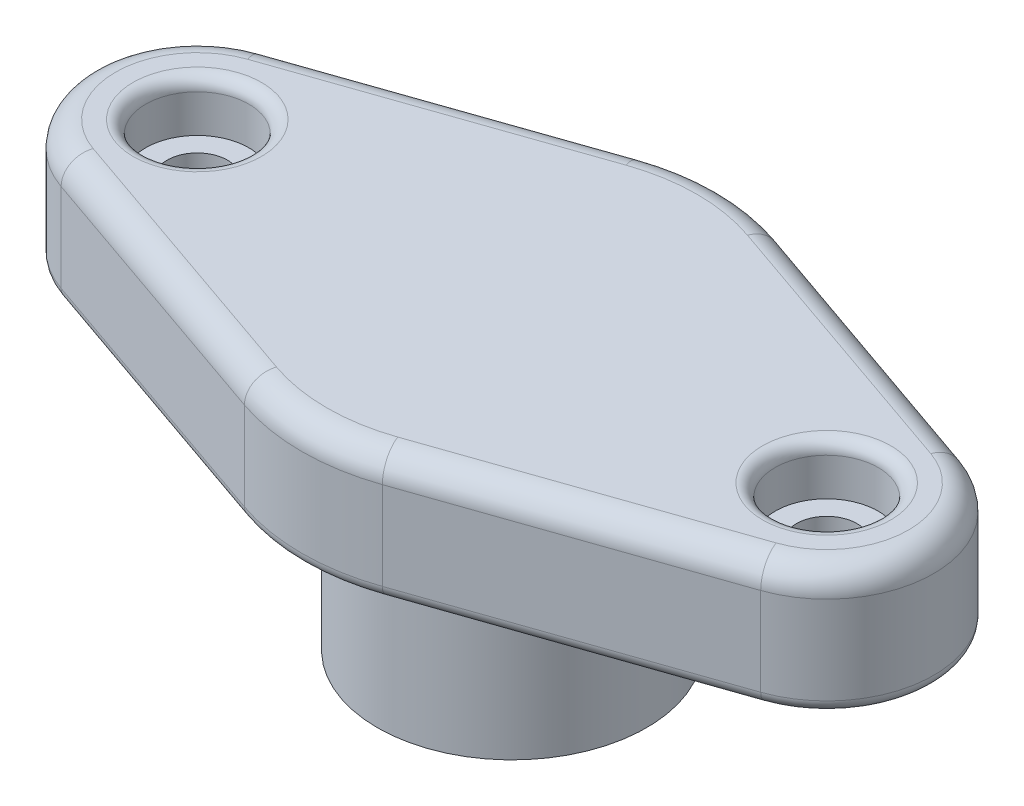
ISO-10303-21;
HEADER;
FILE_DESCRIPTION(('STEP AP214'),'2;1');
FILE_NAME('part.step','',(''),(''),'','','');
FILE_SCHEMA(('AUTOMOTIVE_DESIGN { 1 0 10303 214 1 1 1 1 }'));
ENDSEC;
DATA;
#1=APPLICATION_CONTEXT('core data for automotive mechanical design processes');
#2=APPLICATION_PROTOCOL_DEFINITION('international standard','automotive_design',2000,#1);
#3=PRODUCT_CONTEXT('',#1,'mechanical');
#4=PRODUCT('Part','Part','',(#3));
#5=PRODUCT_RELATED_PRODUCT_CATEGORY('part','',(#4));
#6=PRODUCT_DEFINITION_FORMATION('','',#4);
#7=PRODUCT_DEFINITION_CONTEXT('part definition',#1,'design');
#8=PRODUCT_DEFINITION('design','',#6,#7);
#9=PRODUCT_DEFINITION_SHAPE('','',#8);
#10=(LENGTH_UNIT() NAMED_UNIT(*) SI_UNIT(.MILLI.,.METRE.));
#11=(NAMED_UNIT(*) PLANE_ANGLE_UNIT() SI_UNIT($,.RADIAN.));
#12=(NAMED_UNIT(*) SI_UNIT($,.STERADIAN.) SOLID_ANGLE_UNIT());
#13=UNCERTAINTY_MEASURE_WITH_UNIT(LENGTH_MEASURE(1.E-05),#10,'distance_accuracy_value','');
#14=(GEOMETRIC_REPRESENTATION_CONTEXT(3) GLOBAL_UNCERTAINTY_ASSIGNED_CONTEXT((#13)) GLOBAL_UNIT_ASSIGNED_CONTEXT((#10,
#11,#12)) REPRESENTATION_CONTEXT('',''));
#15=CARTESIAN_POINT('',(0.,0.,0.));
#16=DIRECTION('',(0.,0.,1.));
#17=DIRECTION('',(1.,0.,0.));
#18=AXIS2_PLACEMENT_3D('',#15,#16,#17);
#19=CARTESIAN_POINT('',(12.5,12.,0.));
#20=DIRECTION('',(0.,-1.,0.));
#21=DIRECTION('',(0.,0.,-1.));
#22=AXIS2_PLACEMENT_3D('',#19,#20,#21);
#23=CYLINDRICAL_SURFACE('',#22,1.2);
#24=CARTESIAN_POINT('',(12.5,7.,0.));
#25=DIRECTION('',(0.,1.,0.));
#26=DIRECTION('',(0.,0.,1.));
#27=AXIS2_PLACEMENT_3D('',#24,#25,#26);
#28=CIRCLE('',#27,1.2);
#29=CARTESIAN_POINT('',(12.5,7.,1.2));
#30=VERTEX_POINT('',#29);
#31=EDGE_CURVE('E401',#30,#30,#28,.T.);
#32=ORIENTED_EDGE('',*,*,#31,.F.);
#33=EDGE_LOOP('',(#32));
#34=FACE_BOUND('',#33,.T.);
#35=CARTESIAN_POINT('',(12.5,10.,0.));
#36=DIRECTION('',(0.,1.,0.));
#37=DIRECTION('',(0.,0.,1.));
#38=AXIS2_PLACEMENT_3D('',#35,#36,#37);
#39=CIRCLE('',#38,1.2);
#40=CARTESIAN_POINT('',(12.5,10.,1.2));
#41=VERTEX_POINT('',#40);
#42=EDGE_CURVE('E210',#41,#41,#39,.T.);
#43=ORIENTED_EDGE('',*,*,#42,.T.);
#44=EDGE_LOOP('',(#43));
#45=FACE_BOUND('',#44,.T.);
#46=ADVANCED_FACE('F45',(#34,#45),#23,.F.);
#47=CARTESIAN_POINT('',(-12.5,12.,0.));
#48=DIRECTION('',(0.,-1.,0.));
#49=DIRECTION('',(0.,0.,-1.));
#50=AXIS2_PLACEMENT_3D('',#47,#48,#49);
#51=CYLINDRICAL_SURFACE('',#50,1.2);
#52=CARTESIAN_POINT('',(-12.5,7.,0.));
#53=DIRECTION('',(0.,1.,0.));
#54=DIRECTION('',(0.,0.,1.));
#55=AXIS2_PLACEMENT_3D('',#52,#53,#54);
#56=CIRCLE('',#55,1.2);
#57=CARTESIAN_POINT('',(-12.5,7.,1.2));
#58=VERTEX_POINT('',#57);
#59=EDGE_CURVE('E398',#58,#58,#56,.T.);
#60=ORIENTED_EDGE('',*,*,#59,.F.);
#61=EDGE_LOOP('',(#60));
#62=FACE_BOUND('',#61,.T.);
#63=CARTESIAN_POINT('',(-12.5,10.,0.));
#64=DIRECTION('',(0.,1.,0.));
#65=DIRECTION('',(0.,0.,1.));
#66=AXIS2_PLACEMENT_3D('',#63,#64,#65);
#67=CIRCLE('',#66,1.2);
#68=CARTESIAN_POINT('',(-12.5,10.,1.2));
#69=VERTEX_POINT('',#68);
#70=EDGE_CURVE('E392',#69,#69,#67,.T.);
#71=ORIENTED_EDGE('',*,*,#70,.T.);
#72=EDGE_LOOP('',(#71));
#73=FACE_BOUND('',#72,.T.);
#74=ADVANCED_FACE('F442',(#62,#73),#51,.F.);
#75=CARTESIAN_POINT('',(0.,7.,0.));
#76=DIRECTION('',(0.,-1.,0.));
#77=DIRECTION('',(0.,0.,-1.));
#78=AXIS2_PLACEMENT_3D('',#75,#76,#77);
#79=CYLINDRICAL_SURFACE('',#78,5.35);
#80=CARTESIAN_POINT('',(0.,7.,0.));
#81=DIRECTION('',(0.,1.,0.));
#82=DIRECTION('',(0.,0.,1.));
#83=AXIS2_PLACEMENT_3D('',#80,#81,#82);
#84=CIRCLE('',#83,5.35);
#85=CARTESIAN_POINT('',(0.,7.,5.35));
#86=VERTEX_POINT('',#85);
#87=EDGE_CURVE('E200',#86,#86,#84,.T.);
#88=ORIENTED_EDGE('',*,*,#87,.F.);
#89=EDGE_LOOP('',(#88));
#90=FACE_BOUND('',#89,.T.);
#91=CARTESIAN_POINT('',(0.,0.,0.));
#92=DIRECTION('',(0.,1.,0.));
#93=DIRECTION('',(0.,0.,1.));
#94=AXIS2_PLACEMENT_3D('',#91,#92,#93);
#95=CIRCLE('',#94,5.35);
#96=CARTESIAN_POINT('',(0.,0.,5.35));
#97=VERTEX_POINT('',#96);
#98=EDGE_CURVE('E207',#97,#97,#95,.T.);
#99=ORIENTED_EDGE('',*,*,#98,.T.);
#100=EDGE_LOOP('',(#99));
#101=FACE_BOUND('',#100,.T.);
#102=ADVANCED_FACE('F429',(#90,#101),#79,.T.);
#103=CARTESIAN_POINT('',(0.,0.,0.));
#104=DIRECTION('',(0.,1.,0.));
#105=DIRECTION('',(0.,0.,1.));
#106=AXIS2_PLACEMENT_3D('',#103,#104,#105);
#107=PLANE('',#106);
#108=CARTESIAN_POINT('',(0.,0.,0.));
#109=DIRECTION('',(0.,1.,0.));
#110=DIRECTION('',(0.,0.,1.));
#111=AXIS2_PLACEMENT_3D('',#108,#109,#110);
#112=CIRCLE('',#111,4.5);
#113=CARTESIAN_POINT('',(0.,0.,4.5));
#114=VERTEX_POINT('',#113);
#115=EDGE_CURVE('E55',#114,#114,#112,.T.);
#116=ORIENTED_EDGE('',*,*,#115,.T.);
#117=EDGE_LOOP('',(#116));
#118=FACE_BOUND('',#117,.T.);
#119=ORIENTED_EDGE('',*,*,#98,.F.);
#120=EDGE_LOOP('',(#119));
#121=FACE_BOUND('',#120,.T.);
#122=ADVANCED_FACE('F375',(#118,#121),#107,.F.);
#123=CARTESIAN_POINT('',(0.,12.,0.));
#124=DIRECTION('',(0.,1.,0.));
#125=DIRECTION('',(0.,0.,1.));
#126=AXIS2_PLACEMENT_3D('',#123,#124,#125);
#127=PLANE('',#126);
#128=CARTESIAN_POINT('',(0.,12.,0.));
#129=DIRECTION('',(0.,1.,0.));
#130=DIRECTION('',(0.,0.,1.));
#131=AXIS2_PLACEMENT_3D('',#128,#129,#130);
#132=CIRCLE('',#131,7.35);
#133=CARTESIAN_POINT('',(2.41079999999999,12.,-6.94338126275664));
#134=VERTEX_POINT('',#133);
#135=CARTESIAN_POINT('',(-2.4108,12.,-6.94338126275664));
#136=VERTEX_POINT('',#135);
#137=EDGE_CURVE('E312',#134,#136,#132,.T.);
#138=ORIENTED_EDGE('',*,*,#137,.T.);
#139=DIRECTION('',(-0.944677722824033,0.,0.328));
#140=VECTOR('',#139,1.);
#141=CARTESIAN_POINT('',(-13.566,12.,-3.0702025991781));
#142=LINE('',#141,#140);
#143=CARTESIAN_POINT('',(-13.566,12.,-3.07020259917811));
#144=VERTEX_POINT('',#143);
#145=EDGE_CURVE('E315',#136,#144,#142,.T.);
#146=ORIENTED_EDGE('',*,*,#145,.T.);
#147=CARTESIAN_POINT('',(-12.5,12.,0.));
#148=DIRECTION('',(0.,1.,0.));
#149=DIRECTION('',(0.,0.,1.));
#150=AXIS2_PLACEMENT_3D('',#147,#148,#149);
#151=CIRCLE('',#150,3.25);
#152=CARTESIAN_POINT('',(-13.566,12.,3.0702025991781));
#153=VERTEX_POINT('',#152);
#154=EDGE_CURVE('E268',#144,#153,#151,.T.);
#155=ORIENTED_EDGE('',*,*,#154,.T.);
#156=DIRECTION('',(0.944677722824033,0.,0.328));
#157=VECTOR('',#156,1.);
#158=CARTESIAN_POINT('',(-2.4108,12.,6.94338126275664));
#159=LINE('',#158,#157);
#160=CARTESIAN_POINT('',(-2.4108,12.,6.94338126275664));
#161=VERTEX_POINT('',#160);
#162=EDGE_CURVE('E297',#153,#161,#159,.T.);
#163=ORIENTED_EDGE('',*,*,#162,.T.);
#164=CARTESIAN_POINT('',(0.,12.,0.));
#165=DIRECTION('',(0.,1.,0.));
#166=DIRECTION('',(0.,0.,1.));
#167=AXIS2_PLACEMENT_3D('',#164,#165,#166);
#168=CIRCLE('',#167,7.35);
#169=CARTESIAN_POINT('',(2.4108,12.,6.94338126275664));
#170=VERTEX_POINT('',#169);
#171=EDGE_CURVE('E300',#161,#170,#168,.T.);
#172=ORIENTED_EDGE('',*,*,#171,.T.);
#173=DIRECTION('',(0.944677722824033,0.,-0.328));
#174=VECTOR('',#173,1.);
#175=CARTESIAN_POINT('',(13.566,12.,3.0702025991781));
#176=LINE('',#175,#174);
#177=CARTESIAN_POINT('',(13.566,12.,3.0702025991781));
#178=VERTEX_POINT('',#177);
#179=EDGE_CURVE('E303',#170,#178,#176,.T.);
#180=ORIENTED_EDGE('',*,*,#179,.T.);
#181=CARTESIAN_POINT('',(12.5,12.,0.));
#182=DIRECTION('',(0.,1.,0.));
#183=DIRECTION('',(0.,0.,1.));
#184=AXIS2_PLACEMENT_3D('',#181,#182,#183);
#185=CIRCLE('',#184,3.25);
#186=CARTESIAN_POINT('',(13.566,12.,-3.07020259917811));
#187=VERTEX_POINT('',#186);
#188=EDGE_CURVE('E306',#178,#187,#185,.T.);
#189=ORIENTED_EDGE('',*,*,#188,.T.);
#190=DIRECTION('',(-0.944677722824033,0.,-0.327999999999999));
#191=VECTOR('',#190,1.);
#192=CARTESIAN_POINT('',(2.41079999999999,12.,-6.94338126275664));
#193=LINE('',#192,#191);
#194=EDGE_CURVE('E309',#187,#134,#193,.T.);
#195=ORIENTED_EDGE('',*,*,#194,.T.);
#196=EDGE_LOOP('',(#138,#146,#155,#163,#172,#180,#189,#195));
#197=FACE_BOUND('',#196,.T.);
#198=CARTESIAN_POINT('',(12.5,12.,0.));
#199=DIRECTION('',(0.,1.,0.));
#200=DIRECTION('',(0.,0.,1.));
#201=AXIS2_PLACEMENT_3D('',#198,#199,#200);
#202=CIRCLE('',#201,2.55);
#203=CARTESIAN_POINT('',(12.5,12.,2.55));
#204=VERTEX_POINT('',#203);
#205=EDGE_CURVE('E261',#204,#204,#202,.F.);
#206=ORIENTED_EDGE('',*,*,#205,.T.);
#207=EDGE_LOOP('',(#206));
#208=FACE_BOUND('',#207,.T.);
#209=CARTESIAN_POINT('',(-12.5,12.,0.));
#210=DIRECTION('',(0.,1.,0.));
#211=DIRECTION('',(0.,0.,1.));
#212=AXIS2_PLACEMENT_3D('',#209,#210,#211);
#213=CIRCLE('',#212,2.55);
#214=CARTESIAN_POINT('',(-12.5,12.,2.55));
#215=VERTEX_POINT('',#214);
#216=EDGE_CURVE('E257',#215,#215,#213,.F.);
#217=ORIENTED_EDGE('',*,*,#216,.T.);
#218=EDGE_LOOP('',(#217));
#219=FACE_BOUND('',#218,.T.);
#220=ADVANCED_FACE('F431',(#197,#208,#219),#127,.T.);
#221=CARTESIAN_POINT('',(0.,7.,0.));
#222=DIRECTION('',(0.,1.,0.));
#223=DIRECTION('',(0.,0.,1.));
#224=AXIS2_PLACEMENT_3D('',#221,#222,#223);
#225=PLANE('',#224);
#226=DIRECTION('',(0.944677722824033,0.,0.328));
#227=VECTOR('',#226,1.);
#228=CARTESIAN_POINT('',(-2.5748,7.,7.41572012416865));
#229=LINE('',#228,#227);
#230=CARTESIAN_POINT('',(-2.5748,7.,7.41572012416865));
#231=VERTEX_POINT('',#230);
#232=CARTESIAN_POINT('',(-13.73,7.,3.54254146059012));
#233=VERTEX_POINT('',#232);
#234=EDGE_CURVE('E199',#231,#233,#229,.F.);
#235=ORIENTED_EDGE('',*,*,#234,.T.);
#236=CARTESIAN_POINT('',(-12.5,7.,0.));
#237=DIRECTION('',(0.,1.,0.));
#238=DIRECTION('',(0.,0.,1.));
#239=AXIS2_PLACEMENT_3D('',#236,#237,#238);
#240=CIRCLE('',#239,3.75);
#241=CARTESIAN_POINT('',(-13.73,7.,-3.54254146059012));
#242=VERTEX_POINT('',#241);
#243=EDGE_CURVE('E180',#233,#242,#240,.F.);
#244=ORIENTED_EDGE('',*,*,#243,.T.);
#245=DIRECTION('',(-0.944677722824033,0.,0.328));
#246=VECTOR('',#245,1.);
#247=CARTESIAN_POINT('',(-2.5748,7.,-7.41572012416865));
#248=LINE('',#247,#246);
#249=CARTESIAN_POINT('',(-2.5748,7.,-7.41572012416865));
#250=VERTEX_POINT('',#249);
#251=EDGE_CURVE('E227',#242,#250,#248,.F.);
#252=ORIENTED_EDGE('',*,*,#251,.T.);
#253=CARTESIAN_POINT('',(0.,7.,0.));
#254=DIRECTION('',(0.,1.,0.));
#255=DIRECTION('',(0.,0.,1.));
#256=AXIS2_PLACEMENT_3D('',#253,#254,#255);
#257=CIRCLE('',#256,7.85);
#258=CARTESIAN_POINT('',(2.57479999999999,7.,-7.41572012416865));
#259=VERTEX_POINT('',#258);
#260=EDGE_CURVE('E224',#250,#259,#257,.F.);
#261=ORIENTED_EDGE('',*,*,#260,.T.);
#262=DIRECTION('',(-0.944677722824033,0.,-0.327999999999999));
#263=VECTOR('',#262,1.);
#264=CARTESIAN_POINT('',(2.57479999999999,7.,-7.41572012416865));
#265=LINE('',#264,#263);
#266=CARTESIAN_POINT('',(13.73,7.,-3.54254146059013));
#267=VERTEX_POINT('',#266);
#268=EDGE_CURVE('E221',#259,#267,#265,.F.);
#269=ORIENTED_EDGE('',*,*,#268,.T.);
#270=CARTESIAN_POINT('',(12.5,7.,0.));
#271=DIRECTION('',(0.,1.,0.));
#272=DIRECTION('',(0.,0.,1.));
#273=AXIS2_PLACEMENT_3D('',#270,#271,#272);
#274=CIRCLE('',#273,3.75);
#275=CARTESIAN_POINT('',(13.73,7.,3.54254146059012));
#276=VERTEX_POINT('',#275);
#277=EDGE_CURVE('E218',#267,#276,#274,.F.);
#278=ORIENTED_EDGE('',*,*,#277,.T.);
#279=DIRECTION('',(0.944677722824033,0.,-0.328));
#280=VECTOR('',#279,1.);
#281=CARTESIAN_POINT('',(2.5748,7.,7.41572012416865));
#282=LINE('',#281,#280);
#283=CARTESIAN_POINT('',(2.5748,7.,7.41572012416865));
#284=VERTEX_POINT('',#283);
#285=EDGE_CURVE('E215',#276,#284,#282,.F.);
#286=ORIENTED_EDGE('',*,*,#285,.T.);
#287=CARTESIAN_POINT('',(0.,7.,0.));
#288=DIRECTION('',(0.,1.,0.));
#289=DIRECTION('',(0.,0.,1.));
#290=AXIS2_PLACEMENT_3D('',#287,#288,#289);
#291=CIRCLE('',#290,7.85);
#292=EDGE_CURVE('E204',#284,#231,#291,.F.);
#293=ORIENTED_EDGE('',*,*,#292,.T.);
#294=EDGE_LOOP('',(#235,#244,#252,#261,#269,#278,#286,#293));
#295=FACE_BOUND('',#294,.T.);
#296=ORIENTED_EDGE('',*,*,#87,.T.);
#297=EDGE_LOOP('',(#296));
#298=FACE_BOUND('',#297,.T.);
#299=ORIENTED_EDGE('',*,*,#31,.T.);
#300=EDGE_LOOP('',(#299));
#301=FACE_BOUND('',#300,.T.);
#302=ORIENTED_EDGE('',*,*,#59,.T.);
#303=EDGE_LOOP('',(#302));
#304=FACE_BOUND('',#303,.T.);
#305=ADVANCED_FACE('F438',(#295,#298,#301,#304),#225,.F.);
#306=CARTESIAN_POINT('',(0.,12.,0.));
#307=DIRECTION('',(0.,-1.,0.));
#308=DIRECTION('',(0.,0.,-1.));
#309=AXIS2_PLACEMENT_3D('',#306,#307,#308);
#310=CYLINDRICAL_SURFACE('',#309,8.35);
#311=DIRECTION('',(0.,-1.,0.));
#312=VECTOR('',#311,1.);
#313=CARTESIAN_POINT('',(-2.7388,12.,-7.88805898558067));
#314=LINE('',#313,#312);
#315=CARTESIAN_POINT('',(-2.7388,11.,-7.88805898558067));
#316=VERTEX_POINT('',#315);
#317=CARTESIAN_POINT('',(-2.7388,7.5,-7.88805898558067));
#318=VERTEX_POINT('',#317);
#319=EDGE_CURVE('E421',#316,#318,#314,.T.);
#320=ORIENTED_EDGE('',*,*,#319,.F.);
#321=CARTESIAN_POINT('',(0.,11.,0.));
#322=DIRECTION('',(0.,1.,0.));
#323=DIRECTION('',(0.,0.,1.));
#324=AXIS2_PLACEMENT_3D('',#321,#322,#323);
#325=CIRCLE('',#324,8.35);
#326=CARTESIAN_POINT('',(2.73879999999999,11.,-7.88805898558067));
#327=VERTEX_POINT('',#326);
#328=EDGE_CURVE('E323',#316,#327,#325,.F.);
#329=ORIENTED_EDGE('',*,*,#328,.T.);
#330=DIRECTION('',(0.,-1.,0.));
#331=VECTOR('',#330,1.);
#332=CARTESIAN_POINT('',(2.73879999999999,12.,-7.88805898558067));
#333=LINE('',#332,#331);
#334=CARTESIAN_POINT('',(2.73879999999999,7.5,-7.88805898558067));
#335=VERTEX_POINT('',#334);
#336=EDGE_CURVE('E405',#327,#335,#333,.T.);
#337=ORIENTED_EDGE('',*,*,#336,.T.);
#338=CARTESIAN_POINT('',(0.,7.5,0.));
#339=DIRECTION('',(0.,1.,0.));
#340=DIRECTION('',(0.,0.,1.));
#341=AXIS2_PLACEMENT_3D('',#338,#339,#340);
#342=CIRCLE('',#341,8.35);
#343=EDGE_CURVE('E235',#335,#318,#342,.T.);
#344=ORIENTED_EDGE('',*,*,#343,.T.);
#345=EDGE_LOOP('',(#320,#329,#337,#344));
#346=FACE_BOUND('',#345,.T.);
#347=ADVANCED_FACE('F460',(#346),#310,.T.);
#348=CARTESIAN_POINT('',(-13.894,12.,-4.01488032200213));
#349=DIRECTION('',(0.328,0.,0.944677722824033));
#350=DIRECTION('',(0.944677722824033,0.,-0.328));
#351=AXIS2_PLACEMENT_3D('',#348,#349,#350);
#352=PLANE('',#351);
#353=DIRECTION('',(0.,-1.,0.));
#354=VECTOR('',#353,1.);
#355=CARTESIAN_POINT('',(-13.894,12.,-4.01488032200214));
#356=LINE('',#355,#354);
#357=CARTESIAN_POINT('',(-13.894,11.,-4.01488032200214));
#358=VERTEX_POINT('',#357);
#359=CARTESIAN_POINT('',(-13.894,7.5,-4.01488032200214));
#360=VERTEX_POINT('',#359);
#361=EDGE_CURVE('E169',#358,#360,#356,.T.);
#362=ORIENTED_EDGE('',*,*,#361,.F.);
#363=DIRECTION('',(-0.944677722824033,0.,0.328));
#364=VECTOR('',#363,1.);
#365=CARTESIAN_POINT('',(-2.7388,11.,-7.88805898558067));
#366=LINE('',#365,#364);
#367=EDGE_CURVE('E319',#358,#316,#366,.F.);
#368=ORIENTED_EDGE('',*,*,#367,.T.);
#369=ORIENTED_EDGE('',*,*,#319,.T.);
#370=DIRECTION('',(-0.944677722824033,0.,0.328));
#371=VECTOR('',#370,1.);
#372=CARTESIAN_POINT('',(-13.894,7.5,-4.01488032200213));
#373=LINE('',#372,#371);
#374=EDGE_CURVE('E232',#318,#360,#373,.T.);
#375=ORIENTED_EDGE('',*,*,#374,.T.);
#376=EDGE_LOOP('',(#362,#368,#369,#375));
#377=FACE_BOUND('',#376,.T.);
#378=ADVANCED_FACE('F482',(#377),#352,.F.);
#379=CARTESIAN_POINT('',(-12.5,12.,0.));
#380=DIRECTION('',(0.,-1.,0.));
#381=DIRECTION('',(0.,0.,-1.));
#382=AXIS2_PLACEMENT_3D('',#379,#380,#381);
#383=CYLINDRICAL_SURFACE('',#382,4.25);
#384=DIRECTION('',(0.,-1.,0.));
#385=VECTOR('',#384,1.);
#386=CARTESIAN_POINT('',(-13.894,12.,4.01488032200214));
#387=LINE('',#386,#385);
#388=CARTESIAN_POINT('',(-13.894,11.,4.01488032200214));
#389=VERTEX_POINT('',#388);
#390=CARTESIAN_POINT('',(-13.894,7.5,4.01488032200214));
#391=VERTEX_POINT('',#390);
#392=EDGE_CURVE('E159',#389,#391,#387,.T.);
#393=ORIENTED_EDGE('',*,*,#392,.F.);
#394=CARTESIAN_POINT('',(-12.5,11.,0.));
#395=DIRECTION('',(0.,1.,0.));
#396=DIRECTION('',(0.,0.,1.));
#397=AXIS2_PLACEMENT_3D('',#394,#395,#396);
#398=CIRCLE('',#397,4.25);
#399=EDGE_CURVE('E339',#389,#358,#398,.F.);
#400=ORIENTED_EDGE('',*,*,#399,.T.);
#401=ORIENTED_EDGE('',*,*,#361,.T.);
#402=CARTESIAN_POINT('',(-12.5,7.5,0.));
#403=DIRECTION('',(0.,1.,0.));
#404=DIRECTION('',(0.,0.,1.));
#405=AXIS2_PLACEMENT_3D('',#402,#403,#404);
#406=CIRCLE('',#405,4.25);
#407=EDGE_CURVE('E178',#360,#391,#406,.T.);
#408=ORIENTED_EDGE('',*,*,#407,.T.);
#409=EDGE_LOOP('',(#393,#400,#401,#408));
#410=FACE_BOUND('',#409,.T.);
#411=ADVANCED_FACE('F195',(#410),#383,.T.);
#412=CARTESIAN_POINT('',(-2.7388,12.,7.88805898558067));
#413=DIRECTION('',(0.328,0.,-0.944677722824033));
#414=DIRECTION('',(-0.944677722824033,0.,-0.328));
#415=AXIS2_PLACEMENT_3D('',#412,#413,#414);
#416=PLANE('',#415);
#417=DIRECTION('',(0.,-1.,0.));
#418=VECTOR('',#417,1.);
#419=CARTESIAN_POINT('',(-2.7388,12.,7.88805898558067));
#420=LINE('',#419,#418);
#421=CARTESIAN_POINT('',(-2.7388,11.,7.88805898558067));
#422=VERTEX_POINT('',#421);
#423=CARTESIAN_POINT('',(-2.7388,7.5,7.88805898558067));
#424=VERTEX_POINT('',#423);
#425=EDGE_CURVE('E170',#422,#424,#420,.T.);
#426=ORIENTED_EDGE('',*,*,#425,.F.);
#427=DIRECTION('',(0.944677722824033,0.,0.328));
#428=VECTOR('',#427,1.);
#429=CARTESIAN_POINT('',(-13.894,11.,4.01488032200214));
#430=LINE('',#429,#428);
#431=EDGE_CURVE('E62',#422,#389,#430,.F.);
#432=ORIENTED_EDGE('',*,*,#431,.T.);
#433=ORIENTED_EDGE('',*,*,#392,.T.);
#434=DIRECTION('',(0.944677722824033,0.,0.328));
#435=VECTOR('',#434,1.);
#436=CARTESIAN_POINT('',(-2.7388,7.5,7.88805898558067));
#437=LINE('',#436,#435);
#438=EDGE_CURVE('E163',#391,#424,#437,.T.);
#439=ORIENTED_EDGE('',*,*,#438,.T.);
#440=EDGE_LOOP('',(#426,#432,#433,#439));
#441=FACE_BOUND('',#440,.T.);
#442=ADVANCED_FACE('F161',(#441),#416,.F.);
#443=CARTESIAN_POINT('',(0.,12.,0.));
#444=DIRECTION('',(0.,-1.,0.));
#445=DIRECTION('',(0.,0.,-1.));
#446=AXIS2_PLACEMENT_3D('',#443,#444,#445);
#447=CYLINDRICAL_SURFACE('',#446,8.35);
#448=DIRECTION('',(0.,-1.,0.));
#449=VECTOR('',#448,1.);
#450=CARTESIAN_POINT('',(2.7388,12.,7.88805898558067));
#451=LINE('',#450,#449);
#452=CARTESIAN_POINT('',(2.7388,11.,7.88805898558067));
#453=VERTEX_POINT('',#452);
#454=CARTESIAN_POINT('',(2.7388,7.5,7.88805898558067));
#455=VERTEX_POINT('',#454);
#456=EDGE_CURVE('E414',#453,#455,#451,.T.);
#457=ORIENTED_EDGE('',*,*,#456,.F.);
#458=CARTESIAN_POINT('',(0.,11.,0.));
#459=DIRECTION('',(0.,1.,0.));
#460=DIRECTION('',(0.,0.,1.));
#461=AXIS2_PLACEMENT_3D('',#458,#459,#460);
#462=CIRCLE('',#461,8.35);
#463=EDGE_CURVE('E70',#453,#422,#462,.F.);
#464=ORIENTED_EDGE('',*,*,#463,.T.);
#465=ORIENTED_EDGE('',*,*,#425,.T.);
#466=CARTESIAN_POINT('',(0.,7.5,0.));
#467=DIRECTION('',(0.,1.,0.));
#468=DIRECTION('',(0.,0.,1.));
#469=AXIS2_PLACEMENT_3D('',#466,#467,#468);
#470=CIRCLE('',#469,8.35);
#471=EDGE_CURVE('E193',#424,#455,#470,.T.);
#472=ORIENTED_EDGE('',*,*,#471,.T.);
#473=EDGE_LOOP('',(#457,#464,#465,#472));
#474=FACE_BOUND('',#473,.T.);
#475=ADVANCED_FACE('F474',(#474),#447,.T.);
#476=CARTESIAN_POINT('',(13.894,12.,4.01488032200213));
#477=DIRECTION('',(-0.328,0.,-0.944677722824033));
#478=DIRECTION('',(-0.944677722824033,0.,0.328));
#479=AXIS2_PLACEMENT_3D('',#476,#477,#478);
#480=PLANE('',#479);
#481=DIRECTION('',(0.,-1.,0.));
#482=VECTOR('',#481,1.);
#483=CARTESIAN_POINT('',(13.894,12.,4.01488032200213));
#484=LINE('',#483,#482);
#485=CARTESIAN_POINT('',(13.894,11.,4.01488032200213));
#486=VERTEX_POINT('',#485);
#487=CARTESIAN_POINT('',(13.894,7.5,4.01488032200213));
#488=VERTEX_POINT('',#487);
#489=EDGE_CURVE('E411',#486,#488,#484,.T.);
#490=ORIENTED_EDGE('',*,*,#489,.F.);
#491=DIRECTION('',(0.944677722824033,0.,-0.328));
#492=VECTOR('',#491,1.);
#493=CARTESIAN_POINT('',(2.7388,11.,7.88805898558067));
#494=LINE('',#493,#492);
#495=EDGE_CURVE('E332',#486,#453,#494,.F.);
#496=ORIENTED_EDGE('',*,*,#495,.T.);
#497=ORIENTED_EDGE('',*,*,#456,.T.);
#498=DIRECTION('',(0.944677722824033,0.,-0.328));
#499=VECTOR('',#498,1.);
#500=CARTESIAN_POINT('',(13.894,7.5,4.01488032200213));
#501=LINE('',#500,#499);
#502=EDGE_CURVE('E247',#455,#488,#501,.T.);
#503=ORIENTED_EDGE('',*,*,#502,.T.);
#504=EDGE_LOOP('',(#490,#496,#497,#503));
#505=FACE_BOUND('',#504,.T.);
#506=ADVANCED_FACE('F470',(#505),#480,.F.);
#507=CARTESIAN_POINT('',(12.5,12.,0.));
#508=DIRECTION('',(0.,-1.,0.));
#509=DIRECTION('',(0.,0.,-1.));
#510=AXIS2_PLACEMENT_3D('',#507,#508,#509);
#511=CYLINDRICAL_SURFACE('',#510,4.25);
#512=DIRECTION('',(0.,-1.,0.));
#513=VECTOR('',#512,1.);
#514=CARTESIAN_POINT('',(13.894,12.,-4.01488032200214));
#515=LINE('',#514,#513);
#516=CARTESIAN_POINT('',(13.894,11.,-4.01488032200214));
#517=VERTEX_POINT('',#516);
#518=CARTESIAN_POINT('',(13.894,7.5,-4.01488032200214));
#519=VERTEX_POINT('',#518);
#520=EDGE_CURVE('E408',#517,#519,#515,.T.);
#521=ORIENTED_EDGE('',*,*,#520,.F.);
#522=CARTESIAN_POINT('',(12.5,11.,0.));
#523=DIRECTION('',(0.,1.,0.));
#524=DIRECTION('',(0.,0.,1.));
#525=AXIS2_PLACEMENT_3D('',#522,#523,#524);
#526=CIRCLE('',#525,4.25);
#527=EDGE_CURVE('E329',#517,#486,#526,.F.);
#528=ORIENTED_EDGE('',*,*,#527,.T.);
#529=ORIENTED_EDGE('',*,*,#489,.T.);
#530=CARTESIAN_POINT('',(12.5,7.5,0.));
#531=DIRECTION('',(0.,1.,0.));
#532=DIRECTION('',(0.,0.,1.));
#533=AXIS2_PLACEMENT_3D('',#530,#531,#532);
#534=CIRCLE('',#533,4.25);
#535=EDGE_CURVE('E243',#488,#519,#534,.T.);
#536=ORIENTED_EDGE('',*,*,#535,.T.);
#537=EDGE_LOOP('',(#521,#528,#529,#536));
#538=FACE_BOUND('',#537,.T.);
#539=ADVANCED_FACE('F466',(#538),#511,.T.);
#540=CARTESIAN_POINT('',(2.73879999999999,12.,-7.88805898558067));
#541=DIRECTION('',(-0.327999999999999,0.,0.944677722824033));
#542=DIRECTION('',(0.944677722824033,0.,0.327999999999999));
#543=AXIS2_PLACEMENT_3D('',#540,#541,#542);
#544=PLANE('',#543);
#545=ORIENTED_EDGE('',*,*,#336,.F.);
#546=DIRECTION('',(-0.944677722824033,0.,-0.327999999999999));
#547=VECTOR('',#546,1.);
#548=CARTESIAN_POINT('',(13.894,11.,-4.01488032200214));
#549=LINE('',#548,#547);
#550=EDGE_CURVE('E326',#327,#517,#549,.F.);
#551=ORIENTED_EDGE('',*,*,#550,.T.);
#552=ORIENTED_EDGE('',*,*,#520,.T.);
#553=DIRECTION('',(-0.944677722824033,0.,-0.327999999999999));
#554=VECTOR('',#553,1.);
#555=CARTESIAN_POINT('',(2.73879999999999,7.5,-7.88805898558067));
#556=LINE('',#555,#554);
#557=EDGE_CURVE('E239',#519,#335,#556,.T.);
#558=ORIENTED_EDGE('',*,*,#557,.T.);
#559=EDGE_LOOP('',(#545,#551,#552,#558));
#560=FACE_BOUND('',#559,.T.);
#561=ADVANCED_FACE('F462',(#560),#544,.F.);
#562=CARTESIAN_POINT('',(-12.5,10.,0.));
#563=DIRECTION('',(0.,1.,0.));
#564=DIRECTION('',(0.,0.,1.));
#565=AXIS2_PLACEMENT_3D('',#562,#563,#564);
#566=CYLINDRICAL_SURFACE('',#565,2.05);
#567=CARTESIAN_POINT('',(-12.5,11.5,0.));
#568=DIRECTION('',(0.,1.,0.));
#569=DIRECTION('',(0.,0.,1.));
#570=AXIS2_PLACEMENT_3D('',#567,#568,#569);
#571=CIRCLE('',#570,2.05);
#572=CARTESIAN_POINT('',(-12.5,11.5,2.05));
#573=VERTEX_POINT('',#572);
#574=EDGE_CURVE('E265',#573,#573,#571,.T.);
#575=ORIENTED_EDGE('',*,*,#574,.T.);
#576=EDGE_LOOP('',(#575));
#577=FACE_BOUND('',#576,.T.);
#578=CARTESIAN_POINT('',(-12.5,10.,0.));
#579=DIRECTION('',(0.,1.,0.));
#580=DIRECTION('',(0.,0.,1.));
#581=AXIS2_PLACEMENT_3D('',#578,#579,#580);
#582=CIRCLE('',#581,2.05);
#583=CARTESIAN_POINT('',(-12.5,10.,2.05));
#584=VERTEX_POINT('',#583);
#585=EDGE_CURVE('E388',#584,#584,#582,.T.);
#586=ORIENTED_EDGE('',*,*,#585,.F.);
#587=EDGE_LOOP('',(#586));
#588=FACE_BOUND('',#587,.T.);
#589=ADVANCED_FACE('F465',(#577,#588),#566,.F.);
#590=CARTESIAN_POINT('',(-12.5,10.,0.));
#591=DIRECTION('',(0.,1.,0.));
#592=DIRECTION('',(0.,0.,1.));
#593=AXIS2_PLACEMENT_3D('',#590,#591,#592);
#594=PLANE('',#593);
#595=ORIENTED_EDGE('',*,*,#70,.F.);
#596=EDGE_LOOP('',(#595));
#597=FACE_BOUND('',#596,.T.);
#598=ORIENTED_EDGE('',*,*,#585,.T.);
#599=EDGE_LOOP('',(#598));
#600=FACE_BOUND('',#599,.T.);
#601=ADVANCED_FACE('F669',(#597,#600),#594,.T.);
#602=CARTESIAN_POINT('',(12.5,10.,0.));
#603=DIRECTION('',(0.,1.,0.));
#604=DIRECTION('',(0.,0.,1.));
#605=AXIS2_PLACEMENT_3D('',#602,#603,#604);
#606=CYLINDRICAL_SURFACE('',#605,2.05);
#607=CARTESIAN_POINT('',(12.5,11.5,0.));
#608=DIRECTION('',(0.,1.,0.));
#609=DIRECTION('',(0.,0.,1.));
#610=AXIS2_PLACEMENT_3D('',#607,#608,#609);
#611=CIRCLE('',#610,2.05);
#612=CARTESIAN_POINT('',(12.5,11.5,2.05));
#613=VERTEX_POINT('',#612);
#614=EDGE_CURVE('E192',#613,#613,#611,.T.);
#615=ORIENTED_EDGE('',*,*,#614,.T.);
#616=EDGE_LOOP('',(#615));
#617=FACE_BOUND('',#616,.T.);
#618=CARTESIAN_POINT('',(12.5,10.,0.));
#619=DIRECTION('',(0.,1.,0.));
#620=DIRECTION('',(0.,0.,1.));
#621=AXIS2_PLACEMENT_3D('',#618,#619,#620);
#622=CIRCLE('',#621,2.05);
#623=CARTESIAN_POINT('',(12.5,10.,2.05));
#624=VERTEX_POINT('',#623);
#625=EDGE_CURVE('E294',#624,#624,#622,.T.);
#626=ORIENTED_EDGE('',*,*,#625,.F.);
#627=EDGE_LOOP('',(#626));
#628=FACE_BOUND('',#627,.T.);
#629=ADVANCED_FACE('F672',(#617,#628),#606,.F.);
#630=CARTESIAN_POINT('',(12.5,10.,0.));
#631=DIRECTION('',(0.,1.,0.));
#632=DIRECTION('',(0.,0.,1.));
#633=AXIS2_PLACEMENT_3D('',#630,#631,#632);
#634=PLANE('',#633);
#635=ORIENTED_EDGE('',*,*,#42,.F.);
#636=EDGE_LOOP('',(#635));
#637=FACE_BOUND('',#636,.T.);
#638=ORIENTED_EDGE('',*,*,#625,.T.);
#639=EDGE_LOOP('',(#638));
#640=FACE_BOUND('',#639,.T.);
#641=ADVANCED_FACE('F573',(#637,#640),#634,.T.);
#642=CARTESIAN_POINT('',(12.5,7.5,0.));
#643=DIRECTION('',(0.,1.,0.));
#644=DIRECTION('',(0.,0.,1.));
#645=AXIS2_PLACEMENT_3D('',#642,#643,#644);
#646=TOROIDAL_SURFACE('',#645,3.75,0.5);
#647=CARTESIAN_POINT('',(13.73,7.5,3.54254146059012));
#648=DIRECTION('',(-0.944677722824032,0.,0.328000000000002));
#649=DIRECTION('',(0.328000000000002,0.,0.944677722824032));
#650=AXIS2_PLACEMENT_3D('',#647,#648,#649);
#651=CIRCLE('',#650,0.5);
#652=EDGE_CURVE('E286',#276,#488,#651,.T.);
#653=ORIENTED_EDGE('',*,*,#652,.F.);
#654=ORIENTED_EDGE('',*,*,#277,.F.);
#655=CARTESIAN_POINT('',(13.73,7.5,-3.54254146059013));
#656=DIRECTION('',(-0.944677722824033,0.,-0.327999999999999));
#657=DIRECTION('',(-0.327999999999999,0.,0.944677722824033));
#658=AXIS2_PLACEMENT_3D('',#655,#656,#657);
#659=CIRCLE('',#658,0.5);
#660=EDGE_CURVE('E290',#519,#267,#659,.T.);
#661=ORIENTED_EDGE('',*,*,#660,.F.);
#662=ORIENTED_EDGE('',*,*,#535,.F.);
#663=EDGE_LOOP('',(#653,#654,#661,#662));
#664=FACE_BOUND('',#663,.T.);
#665=ADVANCED_FACE('F544',(#664),#646,.T.);
#666=CARTESIAN_POINT('',(2.57479999999999,7.5,-7.41572012416865));
#667=DIRECTION('',(-0.944677722824033,0.,-0.327999999999999));
#668=DIRECTION('',(-0.327999999999999,0.,0.944677722824033));
#669=AXIS2_PLACEMENT_3D('',#666,#667,#668);
#670=CYLINDRICAL_SURFACE('',#669,0.5);
#671=ORIENTED_EDGE('',*,*,#660,.T.);
#672=ORIENTED_EDGE('',*,*,#268,.F.);
#673=CARTESIAN_POINT('',(2.57479999999999,7.5,-7.41572012416865));
#674=DIRECTION('',(-0.944677722824033,0.,-0.327999999999999));
#675=DIRECTION('',(-0.327999999999999,0.,0.944677722824033));
#676=AXIS2_PLACEMENT_3D('',#673,#674,#675);
#677=CIRCLE('',#676,0.5);
#678=EDGE_CURVE('E282',#335,#259,#677,.T.);
#679=ORIENTED_EDGE('',*,*,#678,.F.);
#680=ORIENTED_EDGE('',*,*,#557,.F.);
#681=EDGE_LOOP('',(#671,#672,#679,#680));
#682=FACE_BOUND('',#681,.T.);
#683=ADVANCED_FACE('F548',(#682),#670,.T.);
#684=CARTESIAN_POINT('',(13.73,7.5,3.54254146059012));
#685=DIRECTION('',(0.944677722824033,0.,-0.328));
#686=DIRECTION('',(-0.328,0.,-0.944677722824033));
#687=AXIS2_PLACEMENT_3D('',#684,#685,#686);
#688=CYLINDRICAL_SURFACE('',#687,0.5);
#689=ORIENTED_EDGE('',*,*,#652,.T.);
#690=ORIENTED_EDGE('',*,*,#502,.F.);
#691=CARTESIAN_POINT('',(2.5748,7.5,7.41572012416865));
#692=DIRECTION('',(-0.944677722824033,0.,0.328));
#693=DIRECTION('',(0.328,0.,0.944677722824033));
#694=AXIS2_PLACEMENT_3D('',#691,#692,#693);
#695=CIRCLE('',#694,0.5);
#696=EDGE_CURVE('E278',#284,#455,#695,.T.);
#697=ORIENTED_EDGE('',*,*,#696,.F.);
#698=ORIENTED_EDGE('',*,*,#285,.F.);
#699=EDGE_LOOP('',(#689,#690,#697,#698));
#700=FACE_BOUND('',#699,.T.);
#701=ADVANCED_FACE('F535',(#700),#688,.T.);
#702=CARTESIAN_POINT('',(0.,7.5,0.));
#703=DIRECTION('',(0.,1.,0.));
#704=DIRECTION('',(0.,0.,1.));
#705=AXIS2_PLACEMENT_3D('',#702,#703,#704);
#706=TOROIDAL_SURFACE('',#705,7.85,0.5);
#707=ORIENTED_EDGE('',*,*,#678,.T.);
#708=ORIENTED_EDGE('',*,*,#260,.F.);
#709=CARTESIAN_POINT('',(-2.5748,7.5,-7.41572012416865));
#710=DIRECTION('',(-0.944677722824033,0.,0.328));
#711=DIRECTION('',(0.328,0.,0.944677722824033));
#712=AXIS2_PLACEMENT_3D('',#709,#710,#711);
#713=CIRCLE('',#712,0.5);
#714=EDGE_CURVE('E274',#318,#250,#713,.T.);
#715=ORIENTED_EDGE('',*,*,#714,.F.);
#716=ORIENTED_EDGE('',*,*,#343,.F.);
#717=EDGE_LOOP('',(#707,#708,#715,#716));
#718=FACE_BOUND('',#717,.T.);
#719=ADVANCED_FACE('F551',(#718),#706,.T.);
#720=CARTESIAN_POINT('',(0.,7.5,0.));
#721=DIRECTION('',(0.,1.,0.));
#722=DIRECTION('',(0.,0.,1.));
#723=AXIS2_PLACEMENT_3D('',#720,#721,#722);
#724=TOROIDAL_SURFACE('',#723,7.85,0.5);
#725=ORIENTED_EDGE('',*,*,#696,.T.);
#726=ORIENTED_EDGE('',*,*,#471,.F.);
#727=CARTESIAN_POINT('',(-2.5748,7.5,7.41572012416865));
#728=DIRECTION('',(-0.944677722824033,0.,-0.328));
#729=DIRECTION('',(-0.328,0.,0.944677722824033));
#730=AXIS2_PLACEMENT_3D('',#727,#728,#729);
#731=CIRCLE('',#730,0.5);
#732=EDGE_CURVE('E190',#231,#424,#731,.T.);
#733=ORIENTED_EDGE('',*,*,#732,.F.);
#734=ORIENTED_EDGE('',*,*,#292,.F.);
#735=EDGE_LOOP('',(#725,#726,#733,#734));
#736=FACE_BOUND('',#735,.T.);
#737=ADVANCED_FACE('F539',(#736),#724,.T.);
#738=CARTESIAN_POINT('',(-13.73,7.5,-3.54254146059012));
#739=DIRECTION('',(-0.944677722824033,0.,0.328));
#740=DIRECTION('',(0.328,0.,0.944677722824033));
#741=AXIS2_PLACEMENT_3D('',#738,#739,#740);
#742=CYLINDRICAL_SURFACE('',#741,0.5);
#743=ORIENTED_EDGE('',*,*,#714,.T.);
#744=ORIENTED_EDGE('',*,*,#251,.F.);
#745=CARTESIAN_POINT('',(-13.73,7.5,-3.54254146059012));
#746=DIRECTION('',(-0.944677722824033,0.,0.327999999999999));
#747=DIRECTION('',(0.327999999999999,0.,0.944677722824033));
#748=AXIS2_PLACEMENT_3D('',#745,#746,#747);
#749=CIRCLE('',#748,0.5);
#750=EDGE_CURVE('E184',#360,#242,#749,.T.);
#751=ORIENTED_EDGE('',*,*,#750,.F.);
#752=ORIENTED_EDGE('',*,*,#374,.F.);
#753=EDGE_LOOP('',(#743,#744,#751,#752));
#754=FACE_BOUND('',#753,.T.);
#755=ADVANCED_FACE('F554',(#754),#742,.T.);
#756=CARTESIAN_POINT('',(-2.5748,7.5,7.41572012416865));
#757=DIRECTION('',(0.944677722824033,0.,0.328));
#758=DIRECTION('',(0.328,0.,-0.944677722824033));
#759=AXIS2_PLACEMENT_3D('',#756,#757,#758);
#760=CYLINDRICAL_SURFACE('',#759,0.5);
#761=ORIENTED_EDGE('',*,*,#732,.T.);
#762=ORIENTED_EDGE('',*,*,#438,.F.);
#763=CARTESIAN_POINT('',(-13.73,7.5,3.54254146059012));
#764=DIRECTION('',(-0.944677722824033,0.,-0.327999999999998));
#765=DIRECTION('',(-0.327999999999998,0.,0.944677722824033));
#766=AXIS2_PLACEMENT_3D('',#763,#764,#765);
#767=CIRCLE('',#766,0.5);
#768=EDGE_CURVE('E176',#233,#391,#767,.T.);
#769=ORIENTED_EDGE('',*,*,#768,.F.);
#770=ORIENTED_EDGE('',*,*,#234,.F.);
#771=EDGE_LOOP('',(#761,#762,#769,#770));
#772=FACE_BOUND('',#771,.T.);
#773=ADVANCED_FACE('F188',(#772),#760,.T.);
#774=CARTESIAN_POINT('',(-12.5,7.5,0.));
#775=DIRECTION('',(0.,1.,0.));
#776=DIRECTION('',(0.,0.,1.));
#777=AXIS2_PLACEMENT_3D('',#774,#775,#776);
#778=TOROIDAL_SURFACE('',#777,3.75,0.5);
#779=ORIENTED_EDGE('',*,*,#750,.T.);
#780=ORIENTED_EDGE('',*,*,#243,.F.);
#781=ORIENTED_EDGE('',*,*,#768,.T.);
#782=ORIENTED_EDGE('',*,*,#407,.F.);
#783=EDGE_LOOP('',(#779,#780,#781,#782));
#784=FACE_BOUND('',#783,.T.);
#785=ADVANCED_FACE('F177',(#784),#778,.T.);
#786=CARTESIAN_POINT('',(12.5,11.5,0.));
#787=DIRECTION('',(0.,1.,0.));
#788=DIRECTION('',(0.,0.,1.));
#789=AXIS2_PLACEMENT_3D('',#786,#787,#788);
#790=TOROIDAL_SURFACE('',#789,2.55,0.5);
#791=ORIENTED_EDGE('',*,*,#205,.F.);
#792=EDGE_LOOP('',(#791));
#793=FACE_BOUND('',#792,.T.);
#794=ORIENTED_EDGE('',*,*,#614,.F.);
#795=EDGE_LOOP('',(#794));
#796=FACE_BOUND('',#795,.T.);
#797=ADVANCED_FACE('F574',(#793,#796),#790,.T.);
#798=CARTESIAN_POINT('',(-12.5,11.5,0.));
#799=DIRECTION('',(0.,1.,0.));
#800=DIRECTION('',(0.,0.,1.));
#801=AXIS2_PLACEMENT_3D('',#798,#799,#800);
#802=TOROIDAL_SURFACE('',#801,2.55,0.5);
#803=ORIENTED_EDGE('',*,*,#216,.F.);
#804=EDGE_LOOP('',(#803));
#805=FACE_BOUND('',#804,.T.);
#806=ORIENTED_EDGE('',*,*,#574,.F.);
#807=EDGE_LOOP('',(#806));
#808=FACE_BOUND('',#807,.T.);
#809=ADVANCED_FACE('F577',(#805,#808),#802,.T.);
#810=CARTESIAN_POINT('',(2.4108,11.,6.94338126275664));
#811=DIRECTION('',(-0.944677722824033,0.,0.328));
#812=DIRECTION('',(0.328,0.,0.944677722824033));
#813=AXIS2_PLACEMENT_3D('',#810,#811,#812);
#814=CYLINDRICAL_SURFACE('',#813,1.);
#815=CARTESIAN_POINT('',(2.4108,11.,6.94338126275664));
#816=DIRECTION('',(-0.944677722824033,0.,0.328));
#817=DIRECTION('',(0.328,0.,0.944677722824033));
#818=AXIS2_PLACEMENT_3D('',#815,#816,#817);
#819=CIRCLE('',#818,1.);
#820=EDGE_CURVE('E364',#453,#170,#819,.T.);
#821=ORIENTED_EDGE('',*,*,#820,.F.);
#822=ORIENTED_EDGE('',*,*,#495,.F.);
#823=CARTESIAN_POINT('',(13.566,11.,3.0702025991781));
#824=DIRECTION('',(0.944677722824033,0.,-0.328));
#825=DIRECTION('',(-0.328,0.,-0.944677722824033));
#826=AXIS2_PLACEMENT_3D('',#823,#824,#825);
#827=CIRCLE('',#826,1.);
#828=EDGE_CURVE('E185',#178,#486,#827,.T.);
#829=ORIENTED_EDGE('',*,*,#828,.F.);
#830=ORIENTED_EDGE('',*,*,#179,.F.);
#831=EDGE_LOOP('',(#821,#822,#829,#830));
#832=FACE_BOUND('',#831,.T.);
#833=ADVANCED_FACE('F530',(#832),#814,.T.);
#834=CARTESIAN_POINT('',(12.5,11.,0.));
#835=DIRECTION('',(0.,1.,0.));
#836=DIRECTION('',(0.,0.,1.));
#837=AXIS2_PLACEMENT_3D('',#834,#835,#836);
#838=TOROIDAL_SURFACE('',#837,3.25,1.);
#839=ORIENTED_EDGE('',*,*,#828,.T.);
#840=ORIENTED_EDGE('',*,*,#527,.F.);
#841=CARTESIAN_POINT('',(13.566,11.,-3.07020259917811));
#842=DIRECTION('',(-0.944677722824033,0.,-0.328));
#843=DIRECTION('',(-0.328000000000001,0.,0.944677722824033));
#844=AXIS2_PLACEMENT_3D('',#841,#842,#843);
#845=CIRCLE('',#844,1.);
#846=EDGE_CURVE('E360',#187,#517,#845,.T.);
#847=ORIENTED_EDGE('',*,*,#846,.F.);
#848=ORIENTED_EDGE('',*,*,#188,.F.);
#849=EDGE_LOOP('',(#839,#840,#847,#848));
#850=FACE_BOUND('',#849,.T.);
#851=ADVANCED_FACE('F523',(#850),#838,.T.);
#852=CARTESIAN_POINT('',(0.,11.,0.));
#853=DIRECTION('',(0.,1.,0.));
#854=DIRECTION('',(0.,0.,1.));
#855=AXIS2_PLACEMENT_3D('',#852,#853,#854);
#856=TOROIDAL_SURFACE('',#855,7.35,1.);
#857=ORIENTED_EDGE('',*,*,#820,.T.);
#858=ORIENTED_EDGE('',*,*,#171,.F.);
#859=CARTESIAN_POINT('',(-2.4108,11.,6.94338126275664));
#860=DIRECTION('',(-0.944677722824033,0.,-0.328));
#861=DIRECTION('',(-0.328,0.,0.944677722824033));
#862=AXIS2_PLACEMENT_3D('',#859,#860,#861);
#863=CIRCLE('',#862,1.);
#864=EDGE_CURVE('E356',#422,#161,#863,.T.);
#865=ORIENTED_EDGE('',*,*,#864,.F.);
#866=ORIENTED_EDGE('',*,*,#463,.F.);
#867=EDGE_LOOP('',(#857,#858,#865,#866));
#868=FACE_BOUND('',#867,.T.);
#869=ADVANCED_FACE('F594',(#868),#856,.T.);
#870=CARTESIAN_POINT('',(2.41079999999999,11.,-6.94338126275664));
#871=DIRECTION('',(0.944677722824033,0.,0.327999999999999));
#872=DIRECTION('',(0.327999999999999,0.,-0.944677722824033));
#873=AXIS2_PLACEMENT_3D('',#870,#871,#872);
#874=CYLINDRICAL_SURFACE('',#873,1.);
#875=ORIENTED_EDGE('',*,*,#846,.T.);
#876=ORIENTED_EDGE('',*,*,#550,.F.);
#877=CARTESIAN_POINT('',(2.41079999999999,11.,-6.94338126275664));
#878=DIRECTION('',(-0.944677722824033,0.,-0.327999999999999));
#879=DIRECTION('',(-0.327999999999999,0.,0.944677722824033));
#880=AXIS2_PLACEMENT_3D('',#877,#878,#879);
#881=CIRCLE('',#880,1.);
#882=EDGE_CURVE('E352',#134,#327,#881,.T.);
#883=ORIENTED_EDGE('',*,*,#882,.F.);
#884=ORIENTED_EDGE('',*,*,#194,.F.);
#885=EDGE_LOOP('',(#875,#876,#883,#884));
#886=FACE_BOUND('',#885,.T.);
#887=ADVANCED_FACE('F515',(#886),#874,.T.);
#888=CARTESIAN_POINT('',(-2.4108,11.,6.94338126275664));
#889=DIRECTION('',(-0.944677722824033,0.,-0.328));
#890=DIRECTION('',(-0.328,0.,0.944677722824033));
#891=AXIS2_PLACEMENT_3D('',#888,#889,#890);
#892=CYLINDRICAL_SURFACE('',#891,1.);
#893=ORIENTED_EDGE('',*,*,#864,.T.);
#894=ORIENTED_EDGE('',*,*,#162,.F.);
#895=CARTESIAN_POINT('',(-13.566,11.,3.07020259917811));
#896=DIRECTION('',(-0.944677722824033,0.,-0.328));
#897=DIRECTION('',(-0.328,0.,0.944677722824033));
#898=AXIS2_PLACEMENT_3D('',#895,#896,#897);
#899=CIRCLE('',#898,1.);
#900=EDGE_CURVE('E348',#389,#153,#899,.T.);
#901=ORIENTED_EDGE('',*,*,#900,.F.);
#902=ORIENTED_EDGE('',*,*,#431,.F.);
#903=EDGE_LOOP('',(#893,#894,#901,#902));
#904=FACE_BOUND('',#903,.T.);
#905=ADVANCED_FACE('F588',(#904),#892,.T.);
#906=CARTESIAN_POINT('',(0.,11.,0.));
#907=DIRECTION('',(0.,1.,0.));
#908=DIRECTION('',(0.,0.,1.));
#909=AXIS2_PLACEMENT_3D('',#906,#907,#908);
#910=TOROIDAL_SURFACE('',#909,7.35,1.);
#911=ORIENTED_EDGE('',*,*,#882,.T.);
#912=ORIENTED_EDGE('',*,*,#328,.F.);
#913=CARTESIAN_POINT('',(-2.4108,11.,-6.94338126275664));
#914=DIRECTION('',(-0.944677722824033,0.,0.328));
#915=DIRECTION('',(0.328,0.,0.944677722824033));
#916=AXIS2_PLACEMENT_3D('',#913,#914,#915);
#917=CIRCLE('',#916,1.);
#918=EDGE_CURVE('E345',#136,#316,#917,.T.);
#919=ORIENTED_EDGE('',*,*,#918,.F.);
#920=ORIENTED_EDGE('',*,*,#137,.F.);
#921=EDGE_LOOP('',(#911,#912,#919,#920));
#922=FACE_BOUND('',#921,.T.);
#923=ADVANCED_FACE('F512',(#922),#910,.T.);
#924=CARTESIAN_POINT('',(-12.5,11.,0.));
#925=DIRECTION('',(0.,1.,0.));
#926=DIRECTION('',(0.,0.,1.));
#927=AXIS2_PLACEMENT_3D('',#924,#925,#926);
#928=TOROIDAL_SURFACE('',#927,3.25,1.);
#929=ORIENTED_EDGE('',*,*,#900,.T.);
#930=ORIENTED_EDGE('',*,*,#154,.F.);
#931=CARTESIAN_POINT('',(-13.566,11.,-3.0702025991781));
#932=DIRECTION('',(0.944677722824033,0.,-0.328));
#933=DIRECTION('',(-0.328,0.,-0.944677722824033));
#934=AXIS2_PLACEMENT_3D('',#931,#932,#933);
#935=CIRCLE('',#934,1.);
#936=EDGE_CURVE('E342',#358,#144,#935,.T.);
#937=ORIENTED_EDGE('',*,*,#936,.F.);
#938=ORIENTED_EDGE('',*,*,#399,.F.);
#939=EDGE_LOOP('',(#929,#930,#937,#938));
#940=FACE_BOUND('',#939,.T.);
#941=ADVANCED_FACE('F505',(#940),#928,.T.);
#942=CARTESIAN_POINT('',(-2.4108,11.,-6.94338126275664));
#943=DIRECTION('',(0.944677722824033,0.,-0.328));
#944=DIRECTION('',(-0.328,0.,-0.944677722824033));
#945=AXIS2_PLACEMENT_3D('',#942,#943,#944);
#946=CYLINDRICAL_SURFACE('',#945,1.);
#947=ORIENTED_EDGE('',*,*,#918,.T.);
#948=ORIENTED_EDGE('',*,*,#367,.F.);
#949=ORIENTED_EDGE('',*,*,#936,.T.);
#950=ORIENTED_EDGE('',*,*,#145,.F.);
#951=EDGE_LOOP('',(#947,#948,#949,#950));
#952=FACE_BOUND('',#951,.T.);
#953=ADVANCED_FACE('F499',(#952),#946,.T.);
#954=CARTESIAN_POINT('',(0.,2.,0.));
#955=DIRECTION('',(0.,-1.,0.));
#956=DIRECTION('',(0.,0.,-1.));
#957=AXIS2_PLACEMENT_3D('',#954,#955,#956);
#958=PLANE('',#957);
#959=CARTESIAN_POINT('',(0.,2.,0.));
#960=DIRECTION('',(0.,-1.,0.));
#961=DIRECTION('',(0.,0.,-1.));
#962=AXIS2_PLACEMENT_3D('',#959,#960,#961);
#963=CIRCLE('',#962,2.5);
#964=CARTESIAN_POINT('',(0.,2.,-2.5));
#965=VERTEX_POINT('',#964);
#966=EDGE_CURVE('E11',#965,#965,#963,.T.);
#967=ORIENTED_EDGE('',*,*,#966,.T.);
#968=EDGE_LOOP('',(#967));
#969=FACE_BOUND('',#968,.T.);
#970=ADVANCED_FACE('F583',(#969),#958,.T.);
#971=CARTESIAN_POINT('',(0.,1.,0.));
#972=DIRECTION('',(0.,-1.,0.));
#973=DIRECTION('',(0.,0.,-1.));
#974=AXIS2_PLACEMENT_3D('',#971,#972,#973);
#975=TOROIDAL_SURFACE('',#974,2.5,1.);
#976=ORIENTED_EDGE('',*,*,#966,.F.);
#977=EDGE_LOOP('',(#976));
#978=FACE_BOUND('',#977,.T.);
#979=CARTESIAN_POINT('',(0.,1.,0.));
#980=DIRECTION('',(0.,-1.,0.));
#981=DIRECTION('',(0.,0.,-1.));
#982=AXIS2_PLACEMENT_3D('',#979,#980,#981);
#983=CIRCLE('',#982,3.5);
#984=CARTESIAN_POINT('',(0.,1.,-3.5));
#985=VERTEX_POINT('',#984);
#986=EDGE_CURVE('E49',#985,#985,#983,.F.);
#987=ORIENTED_EDGE('',*,*,#986,.F.);
#988=EDGE_LOOP('',(#987));
#989=FACE_BOUND('',#988,.T.);
#990=ADVANCED_FACE('F47',(#978,#989),#975,.F.);
#991=CARTESIAN_POINT('',(0.,1.,0.));
#992=DIRECTION('',(0.,1.,0.));
#993=DIRECTION('',(0.,0.,1.));
#994=AXIS2_PLACEMENT_3D('',#991,#992,#993);
#995=TOROIDAL_SURFACE('',#994,4.5,1.);
#996=ORIENTED_EDGE('',*,*,#115,.F.);
#997=EDGE_LOOP('',(#996));
#998=FACE_BOUND('',#997,.T.);
#999=ORIENTED_EDGE('',*,*,#986,.T.);
#1000=EDGE_LOOP('',(#999));
#1001=FACE_BOUND('',#1000,.T.);
#1002=ADVANCED_FACE('F378',(#998,#1001),#995,.T.);
#1003=CLOSED_SHELL('',(#46,#74,#102,#122,#220,#305,#347,#378,#411,#442,#475,#506,#539,#561,#589,
#601,#629,#641,#665,#683,#701,#719,#737,#755,#773,#785,#797,#809,#833,#851,#869,#887,#905,#923,
#941,#953,#970,#990,#1002));
#1004=MANIFOLD_SOLID_BREP('B2',#1003);
#1005=ADVANCED_BREP_SHAPE_REPRESENTATION('',(#18,#1004),#14);
#1006=SHAPE_DEFINITION_REPRESENTATION(#9,#1005);
ENDSEC;
END-ISO-10303-21;
